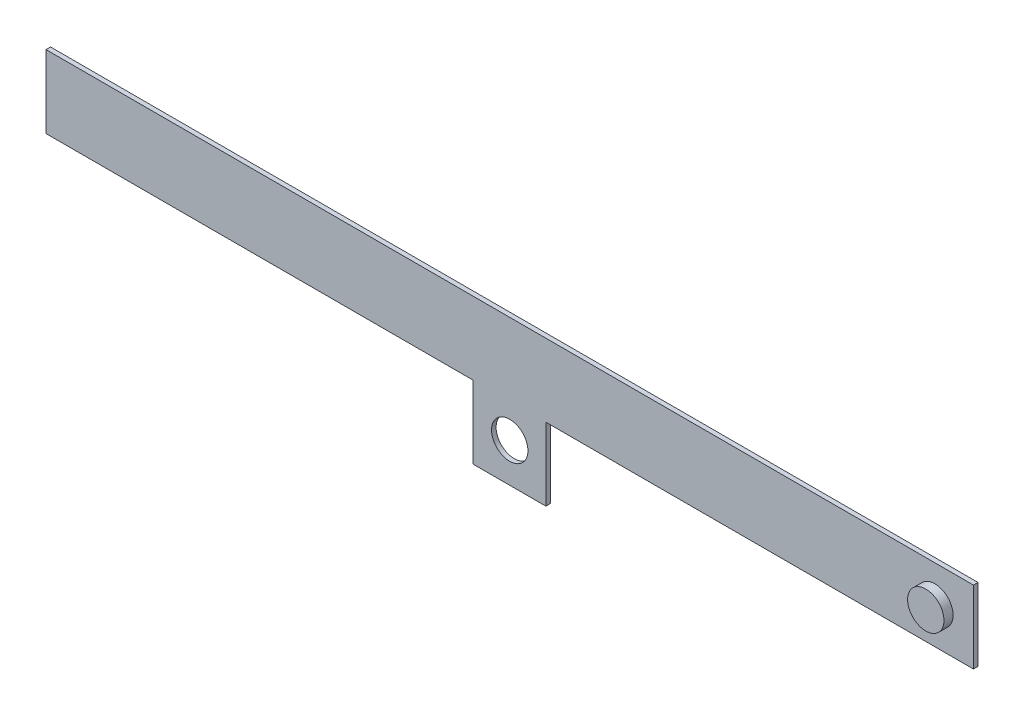
ISO-10303-21;
HEADER;
FILE_DESCRIPTION(('STEP AP214'),'2;1');
FILE_NAME('part.step','',(''),(''),'','','');
FILE_SCHEMA(('AUTOMOTIVE_DESIGN { 1 0 10303 214 1 1 1 1 }'));
ENDSEC;
DATA;
#1=APPLICATION_CONTEXT('core data for automotive mechanical design processes');
#2=APPLICATION_PROTOCOL_DEFINITION('international standard','automotive_design',2000,#1);
#3=PRODUCT_CONTEXT('',#1,'mechanical');
#4=PRODUCT('Part','Part','',(#3));
#5=PRODUCT_RELATED_PRODUCT_CATEGORY('part','',(#4));
#6=PRODUCT_DEFINITION_FORMATION('','',#4);
#7=PRODUCT_DEFINITION_CONTEXT('part definition',#1,'design');
#8=PRODUCT_DEFINITION('design','',#6,#7);
#9=PRODUCT_DEFINITION_SHAPE('','',#8);
#10=(LENGTH_UNIT() NAMED_UNIT(*) SI_UNIT(.MILLI.,.METRE.));
#11=(NAMED_UNIT(*) PLANE_ANGLE_UNIT() SI_UNIT($,.RADIAN.));
#12=(NAMED_UNIT(*) SI_UNIT($,.STERADIAN.) SOLID_ANGLE_UNIT());
#13=UNCERTAINTY_MEASURE_WITH_UNIT(LENGTH_MEASURE(1.E-05),#10,'distance_accuracy_value','');
#14=(GEOMETRIC_REPRESENTATION_CONTEXT(3) GLOBAL_UNCERTAINTY_ASSIGNED_CONTEXT((#13)) GLOBAL_UNIT_ASSIGNED_CONTEXT((#10,
#11,#12)) REPRESENTATION_CONTEXT('',''));
#15=CARTESIAN_POINT('',(0.,0.,0.));
#16=DIRECTION('',(0.,0.,1.));
#17=DIRECTION('',(1.,0.,0.));
#18=AXIS2_PLACEMENT_3D('',#15,#16,#17);
#19=CARTESIAN_POINT('',(0.,0.,3.175));
#20=DIRECTION('',(0.,0.,-1.));
#21=DIRECTION('',(-1.,0.,0.));
#22=AXIS2_PLACEMENT_3D('',#19,#20,#21);
#23=PLANE('',#22);
#24=CARTESIAN_POINT('',(296.91439671607,0.,3.175));
#25=DIRECTION('',(0.,0.,-1.));
#26=DIRECTION('',(-1.,0.,0.));
#27=AXIS2_PLACEMENT_3D('',#24,#25,#26);
#28=CIRCLE('',#27,12.7);
#29=CARTESIAN_POINT('',(284.21439671607,0.,3.175));
#30=VERTEX_POINT('',#29);
#31=EDGE_CURVE('E11',#30,#30,#28,.F.);
#32=ORIENTED_EDGE('',*,*,#31,.F.);
#33=EDGE_LOOP('',(#32));
#34=FACE_BOUND('',#33,.T.);
#35=DIRECTION('',(0.,1.,0.));
#36=VECTOR('',#35,1.);
#37=CARTESIAN_POINT('',(323.85,-25.4,3.175));
#38=LINE('',#37,#36);
#39=CARTESIAN_POINT('',(323.85,-25.4,3.175));
#40=VERTEX_POINT('',#39);
#41=CARTESIAN_POINT('',(323.85,25.4,3.175));
#42=VERTEX_POINT('',#41);
#43=EDGE_CURVE('E165',#40,#42,#38,.T.);
#44=ORIENTED_EDGE('',*,*,#43,.T.);
#45=DIRECTION('',(-1.,0.,0.));
#46=VECTOR('',#45,1.);
#47=CARTESIAN_POINT('',(-323.85,25.4,3.175));
#48=LINE('',#47,#46);
#49=CARTESIAN_POINT('',(-323.85,25.4,3.175));
#50=VERTEX_POINT('',#49);
#51=EDGE_CURVE('E101',#42,#50,#48,.T.);
#52=ORIENTED_EDGE('',*,*,#51,.T.);
#53=DIRECTION('',(0.,-1.,0.));
#54=VECTOR('',#53,1.);
#55=CARTESIAN_POINT('',(-323.85,-25.4,3.175));
#56=LINE('',#55,#54);
#57=CARTESIAN_POINT('',(-323.85,-25.4,3.175));
#58=VERTEX_POINT('',#57);
#59=EDGE_CURVE('E205',#50,#58,#56,.T.);
#60=ORIENTED_EDGE('',*,*,#59,.T.);
#61=DIRECTION('',(1.,0.,0.));
#62=VECTOR('',#61,1.);
#63=CARTESIAN_POINT('',(-323.85,-25.4,3.175));
#64=LINE('',#63,#62);
#65=CARTESIAN_POINT('',(-25.5466755690356,-25.4,3.175));
#66=VERTEX_POINT('',#65);
#67=EDGE_CURVE('E203',#58,#66,#64,.T.);
#68=ORIENTED_EDGE('',*,*,#67,.T.);
#69=DIRECTION('',(0.,-1.,0.));
#70=VECTOR('',#69,1.);
#71=CARTESIAN_POINT('',(-25.5466755690356,-25.4,3.175));
#72=LINE('',#71,#70);
#73=CARTESIAN_POINT('',(-25.5466755690356,-76.2,3.175));
#74=VERTEX_POINT('',#73);
#75=EDGE_CURVE('E120',#66,#74,#72,.T.);
#76=ORIENTED_EDGE('',*,*,#75,.T.);
#77=DIRECTION('',(1.,0.,0.));
#78=VECTOR('',#77,1.);
#79=CARTESIAN_POINT('',(-25.5466755690356,-76.2,3.175));
#80=LINE('',#79,#78);
#81=CARTESIAN_POINT('',(25.2533244309644,-76.2,3.175));
#82=VERTEX_POINT('',#81);
#83=EDGE_CURVE('E114',#74,#82,#80,.T.);
#84=ORIENTED_EDGE('',*,*,#83,.T.);
#85=DIRECTION('',(0.,1.,0.));
#86=VECTOR('',#85,1.);
#87=CARTESIAN_POINT('',(25.2533244309644,-25.4,3.175));
#88=LINE('',#87,#86);
#89=CARTESIAN_POINT('',(25.2533244309644,-25.4,3.175));
#90=VERTEX_POINT('',#89);
#91=EDGE_CURVE('E118',#82,#90,#88,.T.);
#92=ORIENTED_EDGE('',*,*,#91,.T.);
#93=DIRECTION('',(1.,0.,0.));
#94=VECTOR('',#93,1.);
#95=CARTESIAN_POINT('',(25.2533244309644,-25.4,3.175));
#96=LINE('',#95,#94);
#97=EDGE_CURVE('E57',#90,#40,#96,.T.);
#98=ORIENTED_EDGE('',*,*,#97,.T.);
#99=EDGE_LOOP('',(#44,#52,#60,#68,#76,#84,#92,#98));
#100=FACE_BOUND('',#99,.T.);
#101=CARTESIAN_POINT('',(0.,-48.9818720285313,3.175));
#102=DIRECTION('',(0.,0.,1.));
#103=DIRECTION('',(1.,0.,0.));
#104=AXIS2_PLACEMENT_3D('',#101,#102,#103);
#105=CIRCLE('',#104,12.7);
#106=CARTESIAN_POINT('',(12.6999999999999,-48.9818720285313,3.175));
#107=VERTEX_POINT('',#106);
#108=EDGE_CURVE('E147',#107,#107,#105,.T.);
#109=ORIENTED_EDGE('',*,*,#108,.F.);
#110=EDGE_LOOP('',(#109));
#111=FACE_BOUND('',#110,.T.);
#112=ADVANCED_FACE('F39',(#34,#100,#111),#23,.F.);
#113=CARTESIAN_POINT('',(0.,0.,0.));
#114=DIRECTION('',(0.,0.,-1.));
#115=DIRECTION('',(-1.,0.,0.));
#116=AXIS2_PLACEMENT_3D('',#113,#114,#115);
#117=PLANE('',#116);
#118=DIRECTION('',(0.,1.,0.));
#119=VECTOR('',#118,1.);
#120=CARTESIAN_POINT('',(323.85,-25.4,0.));
#121=LINE('',#120,#119);
#122=CARTESIAN_POINT('',(323.85,-25.4,0.));
#123=VERTEX_POINT('',#122);
#124=CARTESIAN_POINT('',(323.85,25.4,0.));
#125=VERTEX_POINT('',#124);
#126=EDGE_CURVE('E142',#123,#125,#121,.T.);
#127=ORIENTED_EDGE('',*,*,#126,.F.);
#128=DIRECTION('',(1.,0.,0.));
#129=VECTOR('',#128,1.);
#130=CARTESIAN_POINT('',(25.2533244309644,-25.4,0.));
#131=LINE('',#130,#129);
#132=CARTESIAN_POINT('',(25.2533244309644,-25.4,0.));
#133=VERTEX_POINT('',#132);
#134=EDGE_CURVE('E92',#133,#123,#131,.T.);
#135=ORIENTED_EDGE('',*,*,#134,.F.);
#136=DIRECTION('',(0.,1.,0.));
#137=VECTOR('',#136,1.);
#138=CARTESIAN_POINT('',(25.2533244309644,-25.4,0.));
#139=LINE('',#138,#137);
#140=CARTESIAN_POINT('',(25.2533244309644,-76.2,0.));
#141=VERTEX_POINT('',#140);
#142=EDGE_CURVE('E86',#141,#133,#139,.T.);
#143=ORIENTED_EDGE('',*,*,#142,.F.);
#144=DIRECTION('',(1.,0.,0.));
#145=VECTOR('',#144,1.);
#146=CARTESIAN_POINT('',(-25.5466755690356,-76.2,0.));
#147=LINE('',#146,#145);
#148=CARTESIAN_POINT('',(-25.5466755690356,-76.2,0.));
#149=VERTEX_POINT('',#148);
#150=EDGE_CURVE('E129',#149,#141,#147,.T.);
#151=ORIENTED_EDGE('',*,*,#150,.F.);
#152=DIRECTION('',(0.,-1.,0.));
#153=VECTOR('',#152,1.);
#154=CARTESIAN_POINT('',(-25.5466755690356,-25.4,0.));
#155=LINE('',#154,#153);
#156=CARTESIAN_POINT('',(-25.5466755690356,-25.4,0.));
#157=VERTEX_POINT('',#156);
#158=EDGE_CURVE('E156',#157,#149,#155,.T.);
#159=ORIENTED_EDGE('',*,*,#158,.F.);
#160=DIRECTION('',(1.,0.,0.));
#161=VECTOR('',#160,1.);
#162=CARTESIAN_POINT('',(-323.85,-25.4,0.));
#163=LINE('',#162,#161);
#164=CARTESIAN_POINT('',(-323.85,-25.4,0.));
#165=VERTEX_POINT('',#164);
#166=EDGE_CURVE('E153',#165,#157,#163,.T.);
#167=ORIENTED_EDGE('',*,*,#166,.F.);
#168=DIRECTION('',(0.,-1.,0.));
#169=VECTOR('',#168,1.);
#170=CARTESIAN_POINT('',(-323.85,-25.4,0.));
#171=LINE('',#170,#169);
#172=CARTESIAN_POINT('',(-323.85,25.4,0.));
#173=VERTEX_POINT('',#172);
#174=EDGE_CURVE('E150',#173,#165,#171,.T.);
#175=ORIENTED_EDGE('',*,*,#174,.F.);
#176=DIRECTION('',(-1.,0.,0.));
#177=VECTOR('',#176,1.);
#178=CARTESIAN_POINT('',(-323.85,25.4,0.));
#179=LINE('',#178,#177);
#180=EDGE_CURVE('E146',#125,#173,#179,.T.);
#181=ORIENTED_EDGE('',*,*,#180,.F.);
#182=EDGE_LOOP('',(#127,#135,#143,#151,#159,#167,#175,#181));
#183=FACE_BOUND('',#182,.T.);
#184=CARTESIAN_POINT('',(0.,-48.9818720285313,0.));
#185=DIRECTION('',(0.,0.,1.));
#186=DIRECTION('',(1.,0.,0.));
#187=AXIS2_PLACEMENT_3D('',#184,#185,#186);
#188=CIRCLE('',#187,12.7);
#189=CARTESIAN_POINT('',(12.6999999999999,-48.9818720285313,0.));
#190=VERTEX_POINT('',#189);
#191=EDGE_CURVE('E215',#190,#190,#188,.T.);
#192=ORIENTED_EDGE('',*,*,#191,.T.);
#193=EDGE_LOOP('',(#192));
#194=FACE_BOUND('',#193,.T.);
#195=ADVANCED_FACE('F190',(#183,#194),#117,.T.);
#196=CARTESIAN_POINT('',(323.85,-25.4,3.175));
#197=DIRECTION('',(-1.,0.,0.));
#198=DIRECTION('',(0.,0.,1.));
#199=AXIS2_PLACEMENT_3D('',#196,#197,#198);
#200=PLANE('',#199);
#201=ORIENTED_EDGE('',*,*,#126,.T.);
#202=DIRECTION('',(0.,0.,-1.));
#203=VECTOR('',#202,1.);
#204=CARTESIAN_POINT('',(323.85,25.4,3.175));
#205=LINE('',#204,#203);
#206=EDGE_CURVE('E49',#42,#125,#205,.T.);
#207=ORIENTED_EDGE('',*,*,#206,.F.);
#208=ORIENTED_EDGE('',*,*,#43,.F.);
#209=DIRECTION('',(0.,0.,-1.));
#210=VECTOR('',#209,1.);
#211=CARTESIAN_POINT('',(323.85,-25.4,3.175));
#212=LINE('',#211,#210);
#213=EDGE_CURVE('E138',#40,#123,#212,.T.);
#214=ORIENTED_EDGE('',*,*,#213,.T.);
#215=EDGE_LOOP('',(#201,#207,#208,#214));
#216=FACE_BOUND('',#215,.T.);
#217=ADVANCED_FACE('F41',(#216),#200,.F.);
#218=CARTESIAN_POINT('',(-323.85,25.4,3.175));
#219=DIRECTION('',(0.,-1.,0.));
#220=DIRECTION('',(0.,0.,-1.));
#221=AXIS2_PLACEMENT_3D('',#218,#219,#220);
#222=PLANE('',#221);
#223=ORIENTED_EDGE('',*,*,#180,.T.);
#224=DIRECTION('',(0.,0.,-1.));
#225=VECTOR('',#224,1.);
#226=CARTESIAN_POINT('',(-323.85,25.4,3.175));
#227=LINE('',#226,#225);
#228=EDGE_CURVE('E180',#50,#173,#227,.T.);
#229=ORIENTED_EDGE('',*,*,#228,.F.);
#230=ORIENTED_EDGE('',*,*,#51,.F.);
#231=ORIENTED_EDGE('',*,*,#206,.T.);
#232=EDGE_LOOP('',(#223,#229,#230,#231));
#233=FACE_BOUND('',#232,.T.);
#234=ADVANCED_FACE('F185',(#233),#222,.F.);
#235=CARTESIAN_POINT('',(-323.85,-25.4,3.175));
#236=DIRECTION('',(1.,0.,0.));
#237=DIRECTION('',(0.,0.,-1.));
#238=AXIS2_PLACEMENT_3D('',#235,#236,#237);
#239=PLANE('',#238);
#240=ORIENTED_EDGE('',*,*,#174,.T.);
#241=DIRECTION('',(0.,0.,-1.));
#242=VECTOR('',#241,1.);
#243=CARTESIAN_POINT('',(-323.85,-25.4,3.175));
#244=LINE('',#243,#242);
#245=EDGE_CURVE('E176',#58,#165,#244,.T.);
#246=ORIENTED_EDGE('',*,*,#245,.F.);
#247=ORIENTED_EDGE('',*,*,#59,.F.);
#248=ORIENTED_EDGE('',*,*,#228,.T.);
#249=EDGE_LOOP('',(#240,#246,#247,#248));
#250=FACE_BOUND('',#249,.T.);
#251=ADVANCED_FACE('F197',(#250),#239,.F.);
#252=CARTESIAN_POINT('',(-323.85,-25.4,3.175));
#253=DIRECTION('',(0.,1.,0.));
#254=DIRECTION('',(0.,0.,1.));
#255=AXIS2_PLACEMENT_3D('',#252,#253,#254);
#256=PLANE('',#255);
#257=ORIENTED_EDGE('',*,*,#166,.T.);
#258=DIRECTION('',(0.,0.,-1.));
#259=VECTOR('',#258,1.);
#260=CARTESIAN_POINT('',(-25.5466755690356,-25.4,3.175));
#261=LINE('',#260,#259);
#262=EDGE_CURVE('E172',#66,#157,#261,.T.);
#263=ORIENTED_EDGE('',*,*,#262,.F.);
#264=ORIENTED_EDGE('',*,*,#67,.F.);
#265=ORIENTED_EDGE('',*,*,#245,.T.);
#266=EDGE_LOOP('',(#257,#263,#264,#265));
#267=FACE_BOUND('',#266,.T.);
#268=ADVANCED_FACE('F201',(#267),#256,.F.);
#269=CARTESIAN_POINT('',(-25.5466755690356,-25.4,3.175));
#270=DIRECTION('',(1.,0.,0.));
#271=DIRECTION('',(0.,1.,0.));
#272=AXIS2_PLACEMENT_3D('',#269,#270,#271);
#273=PLANE('',#272);
#274=ORIENTED_EDGE('',*,*,#158,.T.);
#275=DIRECTION('',(0.,0.,-1.));
#276=VECTOR('',#275,1.);
#277=CARTESIAN_POINT('',(-25.5466755690356,-76.2,3.175));
#278=LINE('',#277,#276);
#279=EDGE_CURVE('E131',#74,#149,#278,.T.);
#280=ORIENTED_EDGE('',*,*,#279,.F.);
#281=ORIENTED_EDGE('',*,*,#75,.F.);
#282=ORIENTED_EDGE('',*,*,#262,.T.);
#283=EDGE_LOOP('',(#274,#280,#281,#282));
#284=FACE_BOUND('',#283,.T.);
#285=ADVANCED_FACE('F251',(#284),#273,.F.);
#286=CARTESIAN_POINT('',(-25.5466755690356,-76.2,3.175));
#287=DIRECTION('',(0.,1.,0.));
#288=DIRECTION('',(0.,0.,1.));
#289=AXIS2_PLACEMENT_3D('',#286,#287,#288);
#290=PLANE('',#289);
#291=ORIENTED_EDGE('',*,*,#150,.T.);
#292=DIRECTION('',(0.,0.,-1.));
#293=VECTOR('',#292,1.);
#294=CARTESIAN_POINT('',(25.2533244309644,-76.2,3.175));
#295=LINE('',#294,#293);
#296=EDGE_CURVE('E126',#82,#141,#295,.T.);
#297=ORIENTED_EDGE('',*,*,#296,.F.);
#298=ORIENTED_EDGE('',*,*,#83,.F.);
#299=ORIENTED_EDGE('',*,*,#279,.T.);
#300=EDGE_LOOP('',(#291,#297,#298,#299));
#301=FACE_BOUND('',#300,.T.);
#302=ADVANCED_FACE('F127',(#301),#290,.F.);
#303=CARTESIAN_POINT('',(25.2533244309644,-25.4,3.175));
#304=DIRECTION('',(-1.,0.,0.));
#305=DIRECTION('',(0.,-1.,0.));
#306=AXIS2_PLACEMENT_3D('',#303,#304,#305);
#307=PLANE('',#306);
#308=ORIENTED_EDGE('',*,*,#142,.T.);
#309=DIRECTION('',(0.,0.,-1.));
#310=VECTOR('',#309,1.);
#311=CARTESIAN_POINT('',(25.2533244309644,-25.4,3.175));
#312=LINE('',#311,#310);
#313=EDGE_CURVE('E132',#90,#133,#312,.T.);
#314=ORIENTED_EDGE('',*,*,#313,.F.);
#315=ORIENTED_EDGE('',*,*,#91,.F.);
#316=ORIENTED_EDGE('',*,*,#296,.T.);
#317=EDGE_LOOP('',(#308,#314,#315,#316));
#318=FACE_BOUND('',#317,.T.);
#319=ADVANCED_FACE('F134',(#318),#307,.F.);
#320=CARTESIAN_POINT('',(25.2533244309644,-25.4,3.175));
#321=DIRECTION('',(0.,1.,0.));
#322=DIRECTION('',(0.,0.,1.));
#323=AXIS2_PLACEMENT_3D('',#320,#321,#322);
#324=PLANE('',#323);
#325=ORIENTED_EDGE('',*,*,#134,.T.);
#326=ORIENTED_EDGE('',*,*,#213,.F.);
#327=ORIENTED_EDGE('',*,*,#97,.F.);
#328=ORIENTED_EDGE('',*,*,#313,.T.);
#329=EDGE_LOOP('',(#325,#326,#327,#328));
#330=FACE_BOUND('',#329,.T.);
#331=ADVANCED_FACE('F244',(#330),#324,.F.);
#332=CARTESIAN_POINT('',(0.,-48.9818720285313,3.175));
#333=DIRECTION('',(0.,0.,-1.));
#334=DIRECTION('',(-1.,0.,0.));
#335=AXIS2_PLACEMENT_3D('',#332,#333,#334);
#336=CYLINDRICAL_SURFACE('',#335,12.7);
#337=ORIENTED_EDGE('',*,*,#108,.T.);
#338=EDGE_LOOP('',(#337));
#339=FACE_BOUND('',#338,.T.);
#340=ORIENTED_EDGE('',*,*,#191,.F.);
#341=EDGE_LOOP('',(#340));
#342=FACE_BOUND('',#341,.T.);
#343=ADVANCED_FACE('F232',(#339,#342),#336,.F.);
#344=CARTESIAN_POINT('',(296.91439671607,0.,9.525));
#345=DIRECTION('',(0.,0.,-1.));
#346=DIRECTION('',(-1.,0.,0.));
#347=AXIS2_PLACEMENT_3D('',#344,#345,#346);
#348=CYLINDRICAL_SURFACE('',#347,12.7);
#349=CARTESIAN_POINT('',(296.91439671607,0.,9.525));
#350=DIRECTION('',(0.,0.,1.));
#351=DIRECTION('',(1.,0.,0.));
#352=AXIS2_PLACEMENT_3D('',#349,#350,#351);
#353=CIRCLE('',#352,12.7);
#354=CARTESIAN_POINT('',(309.61439671607,0.,9.525));
#355=VERTEX_POINT('',#354);
#356=EDGE_CURVE('E219',#355,#355,#353,.T.);
#357=ORIENTED_EDGE('',*,*,#356,.F.);
#358=EDGE_LOOP('',(#357));
#359=FACE_BOUND('',#358,.T.);
#360=ORIENTED_EDGE('',*,*,#31,.T.);
#361=EDGE_LOOP('',(#360));
#362=FACE_BOUND('',#361,.T.);
#363=ADVANCED_FACE('F229',(#359,#362),#348,.T.);
#364=CARTESIAN_POINT('',(296.91439671607,0.,9.525));
#365=DIRECTION('',(0.,0.,1.));
#366=DIRECTION('',(1.,0.,0.));
#367=AXIS2_PLACEMENT_3D('',#364,#365,#366);
#368=PLANE('',#367);
#369=ORIENTED_EDGE('',*,*,#356,.T.);
#370=EDGE_LOOP('',(#369));
#371=FACE_BOUND('',#370,.T.);
#372=ADVANCED_FACE('F227',(#371),#368,.T.);
#373=CLOSED_SHELL('',(#112,#195,#217,#234,#251,#268,#285,#302,#319,#331,#343,#363,#372));
#374=MANIFOLD_SOLID_BREP('B2',#373);
#375=ADVANCED_BREP_SHAPE_REPRESENTATION('',(#18,#374),#14);
#376=SHAPE_DEFINITION_REPRESENTATION(#9,#375);
ENDSEC;
END-ISO-10303-21;
